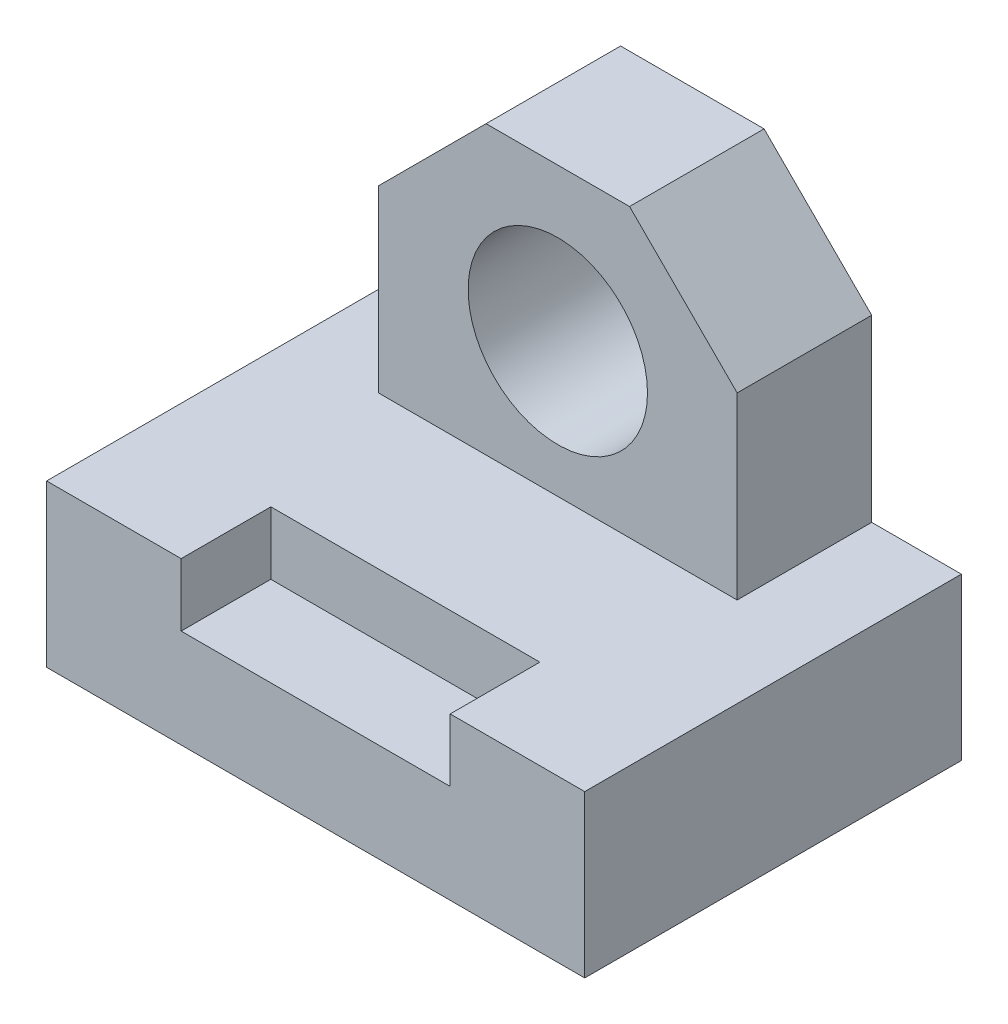
ISO-10303-21;
HEADER;
FILE_DESCRIPTION(('STEP AP214'),'2;1');
FILE_NAME('part.step','',(''),(''),'','','');
FILE_SCHEMA(('AUTOMOTIVE_DESIGN { 1 0 10303 214 1 1 1 1 }'));
ENDSEC;
DATA;
#1=APPLICATION_CONTEXT('core data for automotive mechanical design processes');
#2=APPLICATION_PROTOCOL_DEFINITION('international standard','automotive_design',2000,#1);
#3=PRODUCT_CONTEXT('',#1,'mechanical');
#4=PRODUCT('Part','Part','',(#3));
#5=PRODUCT_RELATED_PRODUCT_CATEGORY('part','',(#4));
#6=PRODUCT_DEFINITION_FORMATION('','',#4);
#7=PRODUCT_DEFINITION_CONTEXT('part definition',#1,'design');
#8=PRODUCT_DEFINITION('design','',#6,#7);
#9=PRODUCT_DEFINITION_SHAPE('','',#8);
#10=(LENGTH_UNIT() NAMED_UNIT(*) SI_UNIT(.MILLI.,.METRE.));
#11=(NAMED_UNIT(*) PLANE_ANGLE_UNIT() SI_UNIT($,.RADIAN.));
#12=(NAMED_UNIT(*) SI_UNIT($,.STERADIAN.) SOLID_ANGLE_UNIT());
#13=UNCERTAINTY_MEASURE_WITH_UNIT(LENGTH_MEASURE(1.E-05),#10,'distance_accuracy_value','');
#14=(GEOMETRIC_REPRESENTATION_CONTEXT(3) GLOBAL_UNCERTAINTY_ASSIGNED_CONTEXT((#13)) GLOBAL_UNIT_ASSIGNED_CONTEXT((#10,
#11,#12)) REPRESENTATION_CONTEXT('',''));
#15=CARTESIAN_POINT('',(0.,0.,0.));
#16=DIRECTION('',(0.,0.,1.));
#17=DIRECTION('',(1.,0.,0.));
#18=AXIS2_PLACEMENT_3D('',#15,#16,#17);
#19=CARTESIAN_POINT('',(30.,18.,42.));
#20=DIRECTION('',(0.,-1.,0.));
#21=DIRECTION('',(0.,0.,-1.));
#22=AXIS2_PLACEMENT_3D('',#19,#20,#21);
#23=PLANE('',#22);
#24=DIRECTION('',(0.,0.,-1.));
#25=VECTOR('',#24,1.);
#26=CARTESIAN_POINT('',(20.,18.,15.));
#27=LINE('',#26,#25);
#28=CARTESIAN_POINT('',(20.,18.,15.));
#29=VERTEX_POINT('',#28);
#30=CARTESIAN_POINT('',(20.,18.,0.));
#31=VERTEX_POINT('',#30);
#32=EDGE_CURVE('E203',#29,#31,#27,.T.);
#33=ORIENTED_EDGE('',*,*,#32,.F.);
#34=DIRECTION('',(-1.,0.,0.));
#35=VECTOR('',#34,1.);
#36=CARTESIAN_POINT('',(20.,18.,15.));
#37=LINE('',#36,#35);
#38=CARTESIAN_POINT('',(-20.,18.,15.));
#39=VERTEX_POINT('',#38);
#40=EDGE_CURVE('E180',#29,#39,#37,.T.);
#41=ORIENTED_EDGE('',*,*,#40,.T.);
#42=DIRECTION('',(0.,0.,-1.));
#43=VECTOR('',#42,1.);
#44=CARTESIAN_POINT('',(-20.,18.,15.));
#45=LINE('',#44,#43);
#46=CARTESIAN_POINT('',(-20.,18.,0.));
#47=VERTEX_POINT('',#46);
#48=EDGE_CURVE('E200',#39,#47,#45,.T.);
#49=ORIENTED_EDGE('',*,*,#48,.T.);
#50=DIRECTION('',(-1.,0.,0.));
#51=VECTOR('',#50,1.);
#52=CARTESIAN_POINT('',(30.,18.,0.));
#53=LINE('',#52,#51);
#54=CARTESIAN_POINT('',(-30.,18.,0.));
#55=VERTEX_POINT('',#54);
#56=EDGE_CURVE('E249',#47,#55,#53,.T.);
#57=ORIENTED_EDGE('',*,*,#56,.T.);
#58=DIRECTION('',(0.,0.,-1.));
#59=VECTOR('',#58,1.);
#60=CARTESIAN_POINT('',(-30.,18.,42.));
#61=LINE('',#60,#59);
#62=CARTESIAN_POINT('',(-30.,18.,42.));
#63=VERTEX_POINT('',#62);
#64=EDGE_CURVE('E244',#63,#55,#61,.T.);
#65=ORIENTED_EDGE('',*,*,#64,.F.);
#66=DIRECTION('',(-1.,0.,0.));
#67=VECTOR('',#66,1.);
#68=CARTESIAN_POINT('',(30.,18.,42.));
#69=LINE('',#68,#67);
#70=CARTESIAN_POINT('',(-15.,18.,42.));
#71=VERTEX_POINT('',#70);
#72=EDGE_CURVE('E240',#71,#63,#69,.T.);
#73=ORIENTED_EDGE('',*,*,#72,.F.);
#74=DIRECTION('',(0.,0.,1.));
#75=VECTOR('',#74,1.);
#76=CARTESIAN_POINT('',(-15.,18.,42.));
#77=LINE('',#76,#75);
#78=CARTESIAN_POINT('',(-15.,18.,32.));
#79=VERTEX_POINT('',#78);
#80=EDGE_CURVE('E198',#79,#71,#77,.T.);
#81=ORIENTED_EDGE('',*,*,#80,.F.);
#82=DIRECTION('',(-1.,0.,0.));
#83=VECTOR('',#82,1.);
#84=CARTESIAN_POINT('',(-15.,18.,32.));
#85=LINE('',#84,#83);
#86=CARTESIAN_POINT('',(15.,18.,32.));
#87=VERTEX_POINT('',#86);
#88=EDGE_CURVE('E206',#87,#79,#85,.T.);
#89=ORIENTED_EDGE('',*,*,#88,.F.);
#90=DIRECTION('',(0.,0.,-1.));
#91=VECTOR('',#90,1.);
#92=CARTESIAN_POINT('',(15.,18.,32.));
#93=LINE('',#92,#91);
#94=CARTESIAN_POINT('',(15.,18.,42.));
#95=VERTEX_POINT('',#94);
#96=EDGE_CURVE('E214',#95,#87,#93,.T.);
#97=ORIENTED_EDGE('',*,*,#96,.F.);
#98=CARTESIAN_POINT('',(30.,18.,42.));
#99=VERTEX_POINT('',#98);
#100=EDGE_CURVE('E236',#99,#95,#69,.T.);
#101=ORIENTED_EDGE('',*,*,#100,.F.);
#102=DIRECTION('',(0.,0.,-1.));
#103=VECTOR('',#102,1.);
#104=CARTESIAN_POINT('',(30.,18.,42.));
#105=LINE('',#104,#103);
#106=CARTESIAN_POINT('',(30.,18.,0.));
#107=VERTEX_POINT('',#106);
#108=EDGE_CURVE('E251',#99,#107,#105,.T.);
#109=ORIENTED_EDGE('',*,*,#108,.T.);
#110=EDGE_CURVE('E234',#107,#31,#53,.T.);
#111=ORIENTED_EDGE('',*,*,#110,.T.);
#112=EDGE_LOOP('',(#33,#41,#49,#57,#65,#73,#81,#89,#97,#101,#109,#111));
#113=FACE_BOUND('',#112,.T.);
#114=ADVANCED_FACE('F43',(#113),#23,.F.);
#115=CARTESIAN_POINT('',(0.,0.,42.));
#116=DIRECTION('',(0.,0.,1.));
#117=DIRECTION('',(1.,0.,0.));
#118=AXIS2_PLACEMENT_3D('',#115,#116,#117);
#119=PLANE('',#118);
#120=DIRECTION('',(1.,0.,0.));
#121=VECTOR('',#120,1.);
#122=CARTESIAN_POINT('',(15.,11.,42.));
#123=LINE('',#122,#121);
#124=CARTESIAN_POINT('',(-15.,11.,42.));
#125=VERTEX_POINT('',#124);
#126=CARTESIAN_POINT('',(15.,11.,42.));
#127=VERTEX_POINT('',#126);
#128=EDGE_CURVE('E202',#125,#127,#123,.T.);
#129=ORIENTED_EDGE('',*,*,#128,.F.);
#130=DIRECTION('',(0.,1.,0.));
#131=VECTOR('',#130,1.);
#132=CARTESIAN_POINT('',(-15.,11.,42.));
#133=LINE('',#132,#131);
#134=EDGE_CURVE('E213',#125,#71,#133,.T.);
#135=ORIENTED_EDGE('',*,*,#134,.T.);
#136=ORIENTED_EDGE('',*,*,#72,.T.);
#137=DIRECTION('',(0.,-1.,0.));
#138=VECTOR('',#137,1.);
#139=CARTESIAN_POINT('',(-30.,18.,42.));
#140=LINE('',#139,#138);
#141=CARTESIAN_POINT('',(-30.,0.,42.));
#142=VERTEX_POINT('',#141);
#143=EDGE_CURVE('E228',#63,#142,#140,.T.);
#144=ORIENTED_EDGE('',*,*,#143,.T.);
#145=DIRECTION('',(1.,0.,0.));
#146=VECTOR('',#145,1.);
#147=CARTESIAN_POINT('',(-30.,0.,42.));
#148=LINE('',#147,#146);
#149=CARTESIAN_POINT('',(30.,0.,42.));
#150=VERTEX_POINT('',#149);
#151=EDGE_CURVE('E232',#142,#150,#148,.T.);
#152=ORIENTED_EDGE('',*,*,#151,.T.);
#153=DIRECTION('',(0.,1.,0.));
#154=VECTOR('',#153,1.);
#155=CARTESIAN_POINT('',(30.,0.,42.));
#156=LINE('',#155,#154);
#157=EDGE_CURVE('E235',#150,#99,#156,.T.);
#158=ORIENTED_EDGE('',*,*,#157,.T.);
#159=ORIENTED_EDGE('',*,*,#100,.T.);
#160=DIRECTION('',(0.,1.,0.));
#161=VECTOR('',#160,1.);
#162=CARTESIAN_POINT('',(15.,11.,42.));
#163=LINE('',#162,#161);
#164=EDGE_CURVE('E223',#127,#95,#163,.T.);
#165=ORIENTED_EDGE('',*,*,#164,.F.);
#166=EDGE_LOOP('',(#129,#135,#136,#144,#152,#158,#159,#165));
#167=FACE_BOUND('',#166,.T.);
#168=ADVANCED_FACE('F277',(#167),#119,.T.);
#169=CARTESIAN_POINT('',(-30.,18.,42.));
#170=DIRECTION('',(1.,0.,0.));
#171=DIRECTION('',(0.,0.,-1.));
#172=AXIS2_PLACEMENT_3D('',#169,#170,#171);
#173=PLANE('',#172);
#174=DIRECTION('',(0.,-1.,0.));
#175=VECTOR('',#174,1.);
#176=CARTESIAN_POINT('',(-30.,18.,0.));
#177=LINE('',#176,#175);
#178=CARTESIAN_POINT('',(-30.,0.,0.));
#179=VERTEX_POINT('',#178);
#180=EDGE_CURVE('E225',#55,#179,#177,.T.);
#181=ORIENTED_EDGE('',*,*,#180,.T.);
#182=DIRECTION('',(0.,0.,-1.));
#183=VECTOR('',#182,1.);
#184=CARTESIAN_POINT('',(-30.,0.,42.));
#185=LINE('',#184,#183);
#186=EDGE_CURVE('E11',#142,#179,#185,.T.);
#187=ORIENTED_EDGE('',*,*,#186,.F.);
#188=ORIENTED_EDGE('',*,*,#143,.F.);
#189=ORIENTED_EDGE('',*,*,#64,.T.);
#190=EDGE_LOOP('',(#181,#187,#188,#189));
#191=FACE_BOUND('',#190,.T.);
#192=ADVANCED_FACE('F44',(#191),#173,.F.);
#193=CARTESIAN_POINT('',(-30.,0.,42.));
#194=DIRECTION('',(0.,1.,0.));
#195=DIRECTION('',(0.,0.,1.));
#196=AXIS2_PLACEMENT_3D('',#193,#194,#195);
#197=PLANE('',#196);
#198=DIRECTION('',(1.,0.,0.));
#199=VECTOR('',#198,1.);
#200=CARTESIAN_POINT('',(-30.,0.,0.));
#201=LINE('',#200,#199);
#202=CARTESIAN_POINT('',(30.,0.,0.));
#203=VERTEX_POINT('',#202);
#204=EDGE_CURVE('E243',#179,#203,#201,.T.);
#205=ORIENTED_EDGE('',*,*,#204,.T.);
#206=DIRECTION('',(0.,0.,-1.));
#207=VECTOR('',#206,1.);
#208=CARTESIAN_POINT('',(30.,0.,42.));
#209=LINE('',#208,#207);
#210=EDGE_CURVE('E51',#150,#203,#209,.T.);
#211=ORIENTED_EDGE('',*,*,#210,.F.);
#212=ORIENTED_EDGE('',*,*,#151,.F.);
#213=ORIENTED_EDGE('',*,*,#186,.T.);
#214=EDGE_LOOP('',(#205,#211,#212,#213));
#215=FACE_BOUND('',#214,.T.);
#216=ADVANCED_FACE('F276',(#215),#197,.F.);
#217=CARTESIAN_POINT('',(30.,0.,42.));
#218=DIRECTION('',(-1.,0.,0.));
#219=DIRECTION('',(0.,0.,1.));
#220=AXIS2_PLACEMENT_3D('',#217,#218,#219);
#221=PLANE('',#220);
#222=DIRECTION('',(0.,1.,0.));
#223=VECTOR('',#222,1.);
#224=CARTESIAN_POINT('',(30.,0.,0.));
#225=LINE('',#224,#223);
#226=EDGE_CURVE('E246',#203,#107,#225,.T.);
#227=ORIENTED_EDGE('',*,*,#226,.T.);
#228=ORIENTED_EDGE('',*,*,#108,.F.);
#229=ORIENTED_EDGE('',*,*,#157,.F.);
#230=ORIENTED_EDGE('',*,*,#210,.T.);
#231=EDGE_LOOP('',(#227,#228,#229,#230));
#232=FACE_BOUND('',#231,.T.);
#233=ADVANCED_FACE('F257',(#232),#221,.F.);
#234=CARTESIAN_POINT('',(0.,0.,0.));
#235=DIRECTION('',(0.,0.,1.));
#236=DIRECTION('',(1.,0.,0.));
#237=AXIS2_PLACEMENT_3D('',#234,#235,#236);
#238=PLANE('',#237);
#239=CARTESIAN_POINT('',(0.,33.,0.));
#240=DIRECTION('',(0.,0.,1.));
#241=DIRECTION('',(1.,0.,0.));
#242=AXIS2_PLACEMENT_3D('',#239,#240,#241);
#243=CIRCLE('',#242,10.);
#244=CARTESIAN_POINT('',(10.,33.,0.));
#245=VERTEX_POINT('',#244);
#246=EDGE_CURVE('E188',#245,#245,#243,.T.);
#247=ORIENTED_EDGE('',*,*,#246,.T.);
#248=EDGE_LOOP('',(#247));
#249=FACE_BOUND('',#248,.T.);
#250=ORIENTED_EDGE('',*,*,#180,.F.);
#251=ORIENTED_EDGE('',*,*,#56,.F.);
#252=DIRECTION('',(0.,1.,0.));
#253=VECTOR('',#252,1.);
#254=CARTESIAN_POINT('',(-20.,18.,0.));
#255=LINE('',#254,#253);
#256=CARTESIAN_POINT('',(-20.,38.,0.));
#257=VERTEX_POINT('',#256);
#258=EDGE_CURVE('E59',#47,#257,#255,.T.);
#259=ORIENTED_EDGE('',*,*,#258,.T.);
#260=DIRECTION('',(0.707106781186549,0.707106781186546,0.));
#261=VECTOR('',#260,1.);
#262=CARTESIAN_POINT('',(-20.,38.,0.));
#263=LINE('',#262,#261);
#264=CARTESIAN_POINT('',(-7.99999999999996,50.,0.));
#265=VERTEX_POINT('',#264);
#266=EDGE_CURVE('E174',#257,#265,#263,.T.);
#267=ORIENTED_EDGE('',*,*,#266,.T.);
#268=DIRECTION('',(1.,0.,0.));
#269=VECTOR('',#268,1.);
#270=CARTESIAN_POINT('',(-7.99999999999996,50.,0.));
#271=LINE('',#270,#269);
#272=CARTESIAN_POINT('',(8.,50.,0.));
#273=VERTEX_POINT('',#272);
#274=EDGE_CURVE('E186',#265,#273,#271,.T.);
#275=ORIENTED_EDGE('',*,*,#274,.T.);
#276=DIRECTION('',(0.707106781186546,-0.707106781186549,0.));
#277=VECTOR('',#276,1.);
#278=CARTESIAN_POINT('',(8.,50.,0.));
#279=LINE('',#278,#277);
#280=CARTESIAN_POINT('',(20.,38.,0.));
#281=VERTEX_POINT('',#280);
#282=EDGE_CURVE('E151',#273,#281,#279,.T.);
#283=ORIENTED_EDGE('',*,*,#282,.T.);
#284=DIRECTION('',(0.,-1.,0.));
#285=VECTOR('',#284,1.);
#286=CARTESIAN_POINT('',(20.,38.,0.));
#287=LINE('',#286,#285);
#288=EDGE_CURVE('E191',#281,#31,#287,.T.);
#289=ORIENTED_EDGE('',*,*,#288,.T.);
#290=ORIENTED_EDGE('',*,*,#110,.F.);
#291=ORIENTED_EDGE('',*,*,#226,.F.);
#292=ORIENTED_EDGE('',*,*,#204,.F.);
#293=EDGE_LOOP('',(#250,#251,#259,#267,#275,#283,#289,#290,#291,#292));
#294=FACE_BOUND('',#293,.T.);
#295=ADVANCED_FACE('F266',(#249,#294),#238,.F.);
#296=CARTESIAN_POINT('',(-15.,11.,42.));
#297=DIRECTION('',(-1.,0.,0.));
#298=DIRECTION('',(0.,0.,1.));
#299=AXIS2_PLACEMENT_3D('',#296,#297,#298);
#300=PLANE('',#299);
#301=ORIENTED_EDGE('',*,*,#80,.T.);
#302=ORIENTED_EDGE('',*,*,#134,.F.);
#303=DIRECTION('',(0.,0.,1.));
#304=VECTOR('',#303,1.);
#305=CARTESIAN_POINT('',(-15.,11.,42.));
#306=LINE('',#305,#304);
#307=CARTESIAN_POINT('',(-15.,11.,32.));
#308=VERTEX_POINT('',#307);
#309=EDGE_CURVE('E66',#308,#125,#306,.T.);
#310=ORIENTED_EDGE('',*,*,#309,.F.);
#311=DIRECTION('',(0.,1.,0.));
#312=VECTOR('',#311,1.);
#313=CARTESIAN_POINT('',(-15.,11.,32.));
#314=LINE('',#313,#312);
#315=EDGE_CURVE('E219',#308,#79,#314,.T.);
#316=ORIENTED_EDGE('',*,*,#315,.T.);
#317=EDGE_LOOP('',(#301,#302,#310,#316));
#318=FACE_BOUND('',#317,.T.);
#319=ADVANCED_FACE('F336',(#318),#300,.F.);
#320=CARTESIAN_POINT('',(-15.,11.,32.));
#321=DIRECTION('',(0.,0.,-1.));
#322=DIRECTION('',(-1.,0.,0.));
#323=AXIS2_PLACEMENT_3D('',#320,#321,#322);
#324=PLANE('',#323);
#325=ORIENTED_EDGE('',*,*,#88,.T.);
#326=ORIENTED_EDGE('',*,*,#315,.F.);
#327=DIRECTION('',(-1.,0.,0.));
#328=VECTOR('',#327,1.);
#329=CARTESIAN_POINT('',(-15.,11.,32.));
#330=LINE('',#329,#328);
#331=CARTESIAN_POINT('',(15.,11.,32.));
#332=VERTEX_POINT('',#331);
#333=EDGE_CURVE('E211',#332,#308,#330,.T.);
#334=ORIENTED_EDGE('',*,*,#333,.F.);
#335=DIRECTION('',(0.,1.,0.));
#336=VECTOR('',#335,1.);
#337=CARTESIAN_POINT('',(15.,11.,32.));
#338=LINE('',#337,#336);
#339=EDGE_CURVE('E224',#332,#87,#338,.T.);
#340=ORIENTED_EDGE('',*,*,#339,.T.);
#341=EDGE_LOOP('',(#325,#326,#334,#340));
#342=FACE_BOUND('',#341,.T.);
#343=ADVANCED_FACE('F355',(#342),#324,.F.);
#344=CARTESIAN_POINT('',(15.,11.,32.));
#345=DIRECTION('',(1.,0.,0.));
#346=DIRECTION('',(0.,0.,-1.));
#347=AXIS2_PLACEMENT_3D('',#344,#345,#346);
#348=PLANE('',#347);
#349=ORIENTED_EDGE('',*,*,#96,.T.);
#350=ORIENTED_EDGE('',*,*,#339,.F.);
#351=DIRECTION('',(0.,0.,-1.));
#352=VECTOR('',#351,1.);
#353=CARTESIAN_POINT('',(15.,11.,32.));
#354=LINE('',#353,#352);
#355=EDGE_CURVE('E208',#127,#332,#354,.T.);
#356=ORIENTED_EDGE('',*,*,#355,.F.);
#357=ORIENTED_EDGE('',*,*,#164,.T.);
#358=EDGE_LOOP('',(#349,#350,#356,#357));
#359=FACE_BOUND('',#358,.T.);
#360=ADVANCED_FACE('F361',(#359),#348,.F.);
#361=CARTESIAN_POINT('',(0.,11.,0.));
#362=DIRECTION('',(0.,-1.,0.));
#363=DIRECTION('',(0.,0.,-1.));
#364=AXIS2_PLACEMENT_3D('',#361,#362,#363);
#365=PLANE('',#364);
#366=ORIENTED_EDGE('',*,*,#309,.T.);
#367=ORIENTED_EDGE('',*,*,#128,.T.);
#368=ORIENTED_EDGE('',*,*,#355,.T.);
#369=ORIENTED_EDGE('',*,*,#333,.T.);
#370=EDGE_LOOP('',(#366,#367,#368,#369));
#371=FACE_BOUND('',#370,.T.);
#372=ADVANCED_FACE('F296',(#371),#365,.F.);
#373=CARTESIAN_POINT('',(-7.99999999999996,50.,15.));
#374=DIRECTION('',(0.,1.,0.));
#375=DIRECTION('',(0.,0.,1.));
#376=AXIS2_PLACEMENT_3D('',#373,#374,#375);
#377=PLANE('',#376);
#378=ORIENTED_EDGE('',*,*,#274,.F.);
#379=DIRECTION('',(0.,0.,-1.));
#380=VECTOR('',#379,1.);
#381=CARTESIAN_POINT('',(-7.99999999999996,50.,15.));
#382=LINE('',#381,#380);
#383=CARTESIAN_POINT('',(-7.99999999999996,50.,15.));
#384=VERTEX_POINT('',#383);
#385=EDGE_CURVE('E168',#384,#265,#382,.T.);
#386=ORIENTED_EDGE('',*,*,#385,.F.);
#387=DIRECTION('',(1.,0.,0.));
#388=VECTOR('',#387,1.);
#389=CARTESIAN_POINT('',(-7.99999999999996,50.,15.));
#390=LINE('',#389,#388);
#391=CARTESIAN_POINT('',(8.,50.,15.));
#392=VERTEX_POINT('',#391);
#393=EDGE_CURVE('E163',#384,#392,#390,.T.);
#394=ORIENTED_EDGE('',*,*,#393,.T.);
#395=DIRECTION('',(0.,0.,-1.));
#396=VECTOR('',#395,1.);
#397=CARTESIAN_POINT('',(8.,50.,15.));
#398=LINE('',#397,#396);
#399=EDGE_CURVE('E148',#392,#273,#398,.T.);
#400=ORIENTED_EDGE('',*,*,#399,.T.);
#401=EDGE_LOOP('',(#378,#386,#394,#400));
#402=FACE_BOUND('',#401,.T.);
#403=ADVANCED_FACE('F166',(#402),#377,.T.);
#404=CARTESIAN_POINT('',(-20.,38.,15.));
#405=DIRECTION('',(-0.707106781186546,0.707106781186549,0.));
#406=DIRECTION('',(-0.707106781186549,-0.707106781186546,0.));
#407=AXIS2_PLACEMENT_3D('',#404,#405,#406);
#408=PLANE('',#407);
#409=ORIENTED_EDGE('',*,*,#266,.F.);
#410=DIRECTION('',(0.,0.,-1.));
#411=VECTOR('',#410,1.);
#412=CARTESIAN_POINT('',(-20.,38.,15.));
#413=LINE('',#412,#411);
#414=CARTESIAN_POINT('',(-20.,38.,15.));
#415=VERTEX_POINT('',#414);
#416=EDGE_CURVE('E197',#415,#257,#413,.T.);
#417=ORIENTED_EDGE('',*,*,#416,.F.);
#418=DIRECTION('',(0.707106781186549,0.707106781186546,0.));
#419=VECTOR('',#418,1.);
#420=CARTESIAN_POINT('',(-20.,38.,15.));
#421=LINE('',#420,#419);
#422=EDGE_CURVE('E160',#415,#384,#421,.T.);
#423=ORIENTED_EDGE('',*,*,#422,.T.);
#424=ORIENTED_EDGE('',*,*,#385,.T.);
#425=EDGE_LOOP('',(#409,#417,#423,#424));
#426=FACE_BOUND('',#425,.T.);
#427=ADVANCED_FACE('F289',(#426),#408,.T.);
#428=CARTESIAN_POINT('',(-20.,18.,15.));
#429=DIRECTION('',(-1.,0.,0.));
#430=DIRECTION('',(0.,0.,1.));
#431=AXIS2_PLACEMENT_3D('',#428,#429,#430);
#432=PLANE('',#431);
#433=ORIENTED_EDGE('',*,*,#258,.F.);
#434=ORIENTED_EDGE('',*,*,#48,.F.);
#435=DIRECTION('',(0.,1.,0.));
#436=VECTOR('',#435,1.);
#437=CARTESIAN_POINT('',(-20.,18.,15.));
#438=LINE('',#437,#436);
#439=EDGE_CURVE('E181',#39,#415,#438,.T.);
#440=ORIENTED_EDGE('',*,*,#439,.T.);
#441=ORIENTED_EDGE('',*,*,#416,.T.);
#442=EDGE_LOOP('',(#433,#434,#440,#441));
#443=FACE_BOUND('',#442,.T.);
#444=ADVANCED_FACE('F286',(#443),#432,.T.);
#445=CARTESIAN_POINT('',(20.,38.,15.));
#446=DIRECTION('',(1.,0.,0.));
#447=DIRECTION('',(0.,0.,-1.));
#448=AXIS2_PLACEMENT_3D('',#445,#446,#447);
#449=PLANE('',#448);
#450=ORIENTED_EDGE('',*,*,#288,.F.);
#451=DIRECTION('',(0.,0.,-1.));
#452=VECTOR('',#451,1.);
#453=CARTESIAN_POINT('',(20.,38.,15.));
#454=LINE('',#453,#452);
#455=CARTESIAN_POINT('',(20.,38.,15.));
#456=VERTEX_POINT('',#455);
#457=EDGE_CURVE('E156',#456,#281,#454,.T.);
#458=ORIENTED_EDGE('',*,*,#457,.F.);
#459=DIRECTION('',(0.,-1.,0.));
#460=VECTOR('',#459,1.);
#461=CARTESIAN_POINT('',(20.,38.,15.));
#462=LINE('',#461,#460);
#463=EDGE_CURVE('E170',#456,#29,#462,.T.);
#464=ORIENTED_EDGE('',*,*,#463,.T.);
#465=ORIENTED_EDGE('',*,*,#32,.T.);
#466=EDGE_LOOP('',(#450,#458,#464,#465));
#467=FACE_BOUND('',#466,.T.);
#468=ADVANCED_FACE('F293',(#467),#449,.T.);
#469=CARTESIAN_POINT('',(8.,50.,15.));
#470=DIRECTION('',(0.707106781186549,0.707106781186546,0.));
#471=DIRECTION('',(-0.707106781186546,0.707106781186549,0.));
#472=AXIS2_PLACEMENT_3D('',#469,#470,#471);
#473=PLANE('',#472);
#474=ORIENTED_EDGE('',*,*,#282,.F.);
#475=ORIENTED_EDGE('',*,*,#399,.F.);
#476=DIRECTION('',(0.707106781186546,-0.707106781186549,0.));
#477=VECTOR('',#476,1.);
#478=CARTESIAN_POINT('',(8.,50.,15.));
#479=LINE('',#478,#477);
#480=EDGE_CURVE('E149',#392,#456,#479,.T.);
#481=ORIENTED_EDGE('',*,*,#480,.T.);
#482=ORIENTED_EDGE('',*,*,#457,.T.);
#483=EDGE_LOOP('',(#474,#475,#481,#482));
#484=FACE_BOUND('',#483,.T.);
#485=ADVANCED_FACE('F146',(#484),#473,.T.);
#486=CARTESIAN_POINT('',(0.,0.,15.));
#487=DIRECTION('',(0.,0.,-1.));
#488=DIRECTION('',(-1.,0.,0.));
#489=AXIS2_PLACEMENT_3D('',#486,#487,#488);
#490=PLANE('',#489);
#491=CARTESIAN_POINT('',(0.,33.,15.));
#492=DIRECTION('',(0.,0.,1.));
#493=DIRECTION('',(1.,0.,0.));
#494=AXIS2_PLACEMENT_3D('',#491,#492,#493);
#495=CIRCLE('',#494,10.);
#496=CARTESIAN_POINT('',(10.,33.,15.));
#497=VERTEX_POINT('',#496);
#498=EDGE_CURVE('E176',#497,#497,#495,.T.);
#499=ORIENTED_EDGE('',*,*,#498,.F.);
#500=EDGE_LOOP('',(#499));
#501=FACE_BOUND('',#500,.T.);
#502=ORIENTED_EDGE('',*,*,#393,.F.);
#503=ORIENTED_EDGE('',*,*,#422,.F.);
#504=ORIENTED_EDGE('',*,*,#439,.F.);
#505=ORIENTED_EDGE('',*,*,#40,.F.);
#506=ORIENTED_EDGE('',*,*,#463,.F.);
#507=ORIENTED_EDGE('',*,*,#480,.F.);
#508=EDGE_LOOP('',(#502,#503,#504,#505,#506,#507));
#509=FACE_BOUND('',#508,.T.);
#510=ADVANCED_FACE('F165',(#501,#509),#490,.F.);
#511=CARTESIAN_POINT('',(0.,33.,0.));
#512=DIRECTION('',(0.,0.,1.));
#513=DIRECTION('',(1.,0.,0.));
#514=AXIS2_PLACEMENT_3D('',#511,#512,#513);
#515=CYLINDRICAL_SURFACE('',#514,10.);
#516=ORIENTED_EDGE('',*,*,#246,.F.);
#517=EDGE_LOOP('',(#516));
#518=FACE_BOUND('',#517,.T.);
#519=ORIENTED_EDGE('',*,*,#498,.T.);
#520=EDGE_LOOP('',(#519));
#521=FACE_BOUND('',#520,.T.);
#522=ADVANCED_FACE('F419',(#518,#521),#515,.F.);
#523=CLOSED_SHELL('',(#114,#168,#192,#216,#233,#295,#319,#343,#360,#372,#403,#427,#444,#468,
#485,#510,#522));
#524=MANIFOLD_SOLID_BREP('B2',#523);
#525=ADVANCED_BREP_SHAPE_REPRESENTATION('',(#18,#524),#14);
#526=SHAPE_DEFINITION_REPRESENTATION(#9,#525);
ENDSEC;
END-ISO-10303-21;
